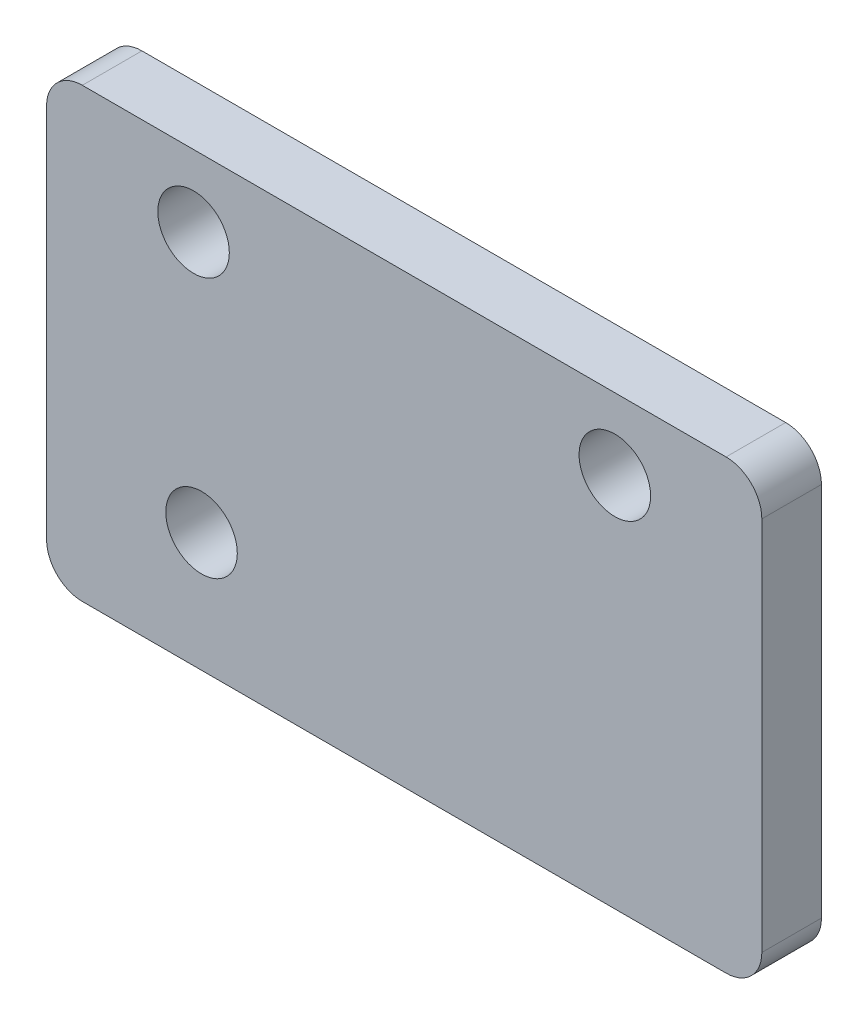
ISO-10303-21;
HEADER;
FILE_DESCRIPTION(('STEP AP214'),'2;1');
FILE_NAME('part.step','',(''),(''),'','','');
FILE_SCHEMA(('AUTOMOTIVE_DESIGN { 1 0 10303 214 1 1 1 1 }'));
ENDSEC;
DATA;
#1=APPLICATION_CONTEXT('core data for automotive mechanical design processes');
#2=APPLICATION_PROTOCOL_DEFINITION('international standard','automotive_design',2000,#1);
#3=PRODUCT_CONTEXT('',#1,'mechanical');
#4=PRODUCT('Part','Part','',(#3));
#5=PRODUCT_RELATED_PRODUCT_CATEGORY('part','',(#4));
#6=PRODUCT_DEFINITION_FORMATION('','',#4);
#7=PRODUCT_DEFINITION_CONTEXT('part definition',#1,'design');
#8=PRODUCT_DEFINITION('design','',#6,#7);
#9=PRODUCT_DEFINITION_SHAPE('','',#8);
#10=(LENGTH_UNIT() NAMED_UNIT(*) SI_UNIT(.MILLI.,.METRE.));
#11=(NAMED_UNIT(*) PLANE_ANGLE_UNIT() SI_UNIT($,.RADIAN.));
#12=(NAMED_UNIT(*) SI_UNIT($,.STERADIAN.) SOLID_ANGLE_UNIT());
#13=UNCERTAINTY_MEASURE_WITH_UNIT(LENGTH_MEASURE(1.E-05),#10,'distance_accuracy_value','');
#14=(GEOMETRIC_REPRESENTATION_CONTEXT(3) GLOBAL_UNCERTAINTY_ASSIGNED_CONTEXT((#13)) GLOBAL_UNIT_ASSIGNED_CONTEXT((#10,
#11,#12)) REPRESENTATION_CONTEXT('',''));
#15=CARTESIAN_POINT('',(0.,0.,0.));
#16=DIRECTION('',(0.,0.,1.));
#17=DIRECTION('',(1.,0.,0.));
#18=AXIS2_PLACEMENT_3D('',#15,#16,#17);
#19=CARTESIAN_POINT('',(38.5,-6.99999999999999,5.));
#20=DIRECTION('',(0.,0.,-1.));
#21=DIRECTION('',(-1.,0.,0.));
#22=AXIS2_PLACEMENT_3D('',#19,#20,#21);
#23=CYLINDRICAL_SURFACE('',#22,3.);
#24=CARTESIAN_POINT('',(38.5,-6.99999999999999,0.));
#25=DIRECTION('',(0.,0.,1.));
#26=DIRECTION('',(1.,0.,0.));
#27=AXIS2_PLACEMENT_3D('',#24,#25,#26);
#28=CIRCLE('',#27,3.);
#29=CARTESIAN_POINT('',(38.5,-9.99999999999999,0.));
#30=VERTEX_POINT('',#29);
#31=CARTESIAN_POINT('',(41.5,-6.99999999999997,0.));
#32=VERTEX_POINT('',#31);
#33=EDGE_CURVE('E137',#30,#32,#28,.T.);
#34=ORIENTED_EDGE('',*,*,#33,.T.);
#35=DIRECTION('',(0.,0.,-1.));
#36=VECTOR('',#35,1.);
#37=CARTESIAN_POINT('',(41.5,-6.99999999999997,5.));
#38=LINE('',#37,#36);
#39=CARTESIAN_POINT('',(41.5,-6.99999999999997,5.));
#40=VERTEX_POINT('',#39);
#41=EDGE_CURVE('E49',#40,#32,#38,.T.);
#42=ORIENTED_EDGE('',*,*,#41,.F.);
#43=CARTESIAN_POINT('',(38.5,-6.99999999999999,5.));
#44=DIRECTION('',(0.,0.,1.));
#45=DIRECTION('',(1.,0.,0.));
#46=AXIS2_PLACEMENT_3D('',#43,#44,#45);
#47=CIRCLE('',#46,3.);
#48=CARTESIAN_POINT('',(38.5,-9.99999999999999,5.));
#49=VERTEX_POINT('',#48);
#50=EDGE_CURVE('E212',#49,#40,#47,.T.);
#51=ORIENTED_EDGE('',*,*,#50,.F.);
#52=DIRECTION('',(0.,0.,-1.));
#53=VECTOR('',#52,1.);
#54=CARTESIAN_POINT('',(38.5,-9.99999999999999,5.));
#55=LINE('',#54,#53);
#56=EDGE_CURVE('E11',#49,#30,#55,.T.);
#57=ORIENTED_EDGE('',*,*,#56,.T.);
#58=EDGE_LOOP('',(#34,#42,#51,#57));
#59=FACE_BOUND('',#58,.T.);
#60=ADVANCED_FACE('F41',(#59),#23,.T.);
#61=CARTESIAN_POINT('',(41.5,24.5,5.));
#62=DIRECTION('',(-1.,0.,0.));
#63=DIRECTION('',(0.,-1.,0.));
#64=AXIS2_PLACEMENT_3D('',#61,#62,#63);
#65=PLANE('',#64);
#66=DIRECTION('',(0.,1.,0.));
#67=VECTOR('',#66,1.);
#68=CARTESIAN_POINT('',(41.5,24.5,0.));
#69=LINE('',#68,#67);
#70=CARTESIAN_POINT('',(41.5,24.5,0.));
#71=VERTEX_POINT('',#70);
#72=EDGE_CURVE('E145',#32,#71,#69,.T.);
#73=ORIENTED_EDGE('',*,*,#72,.T.);
#74=DIRECTION('',(0.,0.,-1.));
#75=VECTOR('',#74,1.);
#76=CARTESIAN_POINT('',(41.5,24.5,5.));
#77=LINE('',#76,#75);
#78=CARTESIAN_POINT('',(41.5,24.5,5.));
#79=VERTEX_POINT('',#78);
#80=EDGE_CURVE('E157',#79,#71,#77,.T.);
#81=ORIENTED_EDGE('',*,*,#80,.F.);
#82=DIRECTION('',(0.,1.,0.));
#83=VECTOR('',#82,1.);
#84=CARTESIAN_POINT('',(41.5,24.5,5.));
#85=LINE('',#84,#83);
#86=EDGE_CURVE('E201',#40,#79,#85,.T.);
#87=ORIENTED_EDGE('',*,*,#86,.F.);
#88=ORIENTED_EDGE('',*,*,#41,.T.);
#89=EDGE_LOOP('',(#73,#81,#87,#88));
#90=FACE_BOUND('',#89,.T.);
#91=ADVANCED_FACE('F194',(#90),#65,.F.);
#92=CARTESIAN_POINT('',(38.5,24.5,5.));
#93=DIRECTION('',(0.,0.,-1.));
#94=DIRECTION('',(-1.,0.,0.));
#95=AXIS2_PLACEMENT_3D('',#92,#93,#94);
#96=CYLINDRICAL_SURFACE('',#95,3.);
#97=CARTESIAN_POINT('',(38.5,24.5,0.));
#98=DIRECTION('',(0.,0.,1.));
#99=DIRECTION('',(-1.,0.,0.));
#100=AXIS2_PLACEMENT_3D('',#97,#98,#99);
#101=CIRCLE('',#100,3.);
#102=CARTESIAN_POINT('',(38.5,27.5,0.));
#103=VERTEX_POINT('',#102);
#104=EDGE_CURVE('E143',#71,#103,#101,.T.);
#105=ORIENTED_EDGE('',*,*,#104,.T.);
#106=DIRECTION('',(0.,0.,-1.));
#107=VECTOR('',#106,1.);
#108=CARTESIAN_POINT('',(38.5,27.5,5.));
#109=LINE('',#108,#107);
#110=CARTESIAN_POINT('',(38.5,27.5,5.));
#111=VERTEX_POINT('',#110);
#112=EDGE_CURVE('E160',#111,#103,#109,.T.);
#113=ORIENTED_EDGE('',*,*,#112,.F.);
#114=CARTESIAN_POINT('',(38.5,24.5,5.));
#115=DIRECTION('',(0.,0.,1.));
#116=DIRECTION('',(-1.,0.,0.));
#117=AXIS2_PLACEMENT_3D('',#114,#115,#116);
#118=CIRCLE('',#117,3.);
#119=EDGE_CURVE('E214',#79,#111,#118,.T.);
#120=ORIENTED_EDGE('',*,*,#119,.F.);
#121=ORIENTED_EDGE('',*,*,#80,.T.);
#122=EDGE_LOOP('',(#105,#113,#120,#121));
#123=FACE_BOUND('',#122,.T.);
#124=ADVANCED_FACE('F198',(#123),#96,.T.);
#125=CARTESIAN_POINT('',(-15.5,27.5,5.));
#126=DIRECTION('',(0.,-1.,0.));
#127=DIRECTION('',(1.,0.,0.));
#128=AXIS2_PLACEMENT_3D('',#125,#126,#127);
#129=PLANE('',#128);
#130=DIRECTION('',(-1.,0.,0.));
#131=VECTOR('',#130,1.);
#132=CARTESIAN_POINT('',(-15.5,27.5,0.));
#133=LINE('',#132,#131);
#134=CARTESIAN_POINT('',(-15.5,27.5,0.));
#135=VERTEX_POINT('',#134);
#136=EDGE_CURVE('E146',#103,#135,#133,.T.);
#137=ORIENTED_EDGE('',*,*,#136,.T.);
#138=DIRECTION('',(0.,0.,-1.));
#139=VECTOR('',#138,1.);
#140=CARTESIAN_POINT('',(-15.5,27.5,5.));
#141=LINE('',#140,#139);
#142=CARTESIAN_POINT('',(-15.5,27.5,5.));
#143=VERTEX_POINT('',#142);
#144=EDGE_CURVE('E128',#143,#135,#141,.T.);
#145=ORIENTED_EDGE('',*,*,#144,.F.);
#146=DIRECTION('',(-1.,0.,0.));
#147=VECTOR('',#146,1.);
#148=CARTESIAN_POINT('',(-15.5,27.5,5.));
#149=LINE('',#148,#147);
#150=EDGE_CURVE('E119',#111,#143,#149,.T.);
#151=ORIENTED_EDGE('',*,*,#150,.F.);
#152=ORIENTED_EDGE('',*,*,#112,.T.);
#153=EDGE_LOOP('',(#137,#145,#151,#152));
#154=FACE_BOUND('',#153,.T.);
#155=ADVANCED_FACE('F208',(#154),#129,.F.);
#156=CARTESIAN_POINT('',(-15.5,24.5,5.));
#157=DIRECTION('',(0.,0.,-1.));
#158=DIRECTION('',(-1.,0.,0.));
#159=AXIS2_PLACEMENT_3D('',#156,#157,#158);
#160=CYLINDRICAL_SURFACE('',#159,3.);
#161=CARTESIAN_POINT('',(-15.5,24.5,0.));
#162=DIRECTION('',(0.,0.,1.));
#163=DIRECTION('',(1.,0.,0.));
#164=AXIS2_PLACEMENT_3D('',#161,#162,#163);
#165=CIRCLE('',#164,3.);
#166=CARTESIAN_POINT('',(-18.5,24.5,0.));
#167=VERTEX_POINT('',#166);
#168=EDGE_CURVE('E130',#135,#167,#165,.T.);
#169=ORIENTED_EDGE('',*,*,#168,.T.);
#170=DIRECTION('',(0.,0.,-1.));
#171=VECTOR('',#170,1.);
#172=CARTESIAN_POINT('',(-18.5,24.5,5.));
#173=LINE('',#172,#171);
#174=CARTESIAN_POINT('',(-18.5,24.5,5.));
#175=VERTEX_POINT('',#174);
#176=EDGE_CURVE('E123',#175,#167,#173,.T.);
#177=ORIENTED_EDGE('',*,*,#176,.F.);
#178=CARTESIAN_POINT('',(-15.5,24.5,5.));
#179=DIRECTION('',(0.,0.,1.));
#180=DIRECTION('',(1.,0.,0.));
#181=AXIS2_PLACEMENT_3D('',#178,#179,#180);
#182=CIRCLE('',#181,3.);
#183=EDGE_CURVE('E112',#143,#175,#182,.T.);
#184=ORIENTED_EDGE('',*,*,#183,.F.);
#185=ORIENTED_EDGE('',*,*,#144,.T.);
#186=EDGE_LOOP('',(#169,#177,#184,#185));
#187=FACE_BOUND('',#186,.T.);
#188=ADVANCED_FACE('F129',(#187),#160,.T.);
#189=CARTESIAN_POINT('',(-18.5,24.5,5.));
#190=DIRECTION('',(1.,0.,0.));
#191=DIRECTION('',(0.,1.,0.));
#192=AXIS2_PLACEMENT_3D('',#189,#190,#191);
#193=PLANE('',#192);
#194=DIRECTION('',(0.,-1.,0.));
#195=VECTOR('',#194,1.);
#196=CARTESIAN_POINT('',(-18.5,24.5,0.));
#197=LINE('',#196,#195);
#198=CARTESIAN_POINT('',(-18.5,-6.99999999999998,0.));
#199=VERTEX_POINT('',#198);
#200=EDGE_CURVE('E87',#167,#199,#197,.T.);
#201=ORIENTED_EDGE('',*,*,#200,.T.);
#202=DIRECTION('',(0.,0.,-1.));
#203=VECTOR('',#202,1.);
#204=CARTESIAN_POINT('',(-18.5,-6.99999999999998,5.));
#205=LINE('',#204,#203);
#206=CARTESIAN_POINT('',(-18.5,-6.99999999999998,5.));
#207=VERTEX_POINT('',#206);
#208=EDGE_CURVE('E127',#207,#199,#205,.T.);
#209=ORIENTED_EDGE('',*,*,#208,.F.);
#210=DIRECTION('',(0.,-1.,0.));
#211=VECTOR('',#210,1.);
#212=CARTESIAN_POINT('',(-18.5,24.5,5.));
#213=LINE('',#212,#211);
#214=EDGE_CURVE('E117',#175,#207,#213,.T.);
#215=ORIENTED_EDGE('',*,*,#214,.F.);
#216=ORIENTED_EDGE('',*,*,#176,.T.);
#217=EDGE_LOOP('',(#201,#209,#215,#216));
#218=FACE_BOUND('',#217,.T.);
#219=ADVANCED_FACE('F135',(#218),#193,.F.);
#220=CARTESIAN_POINT('',(-15.5,-7.,5.));
#221=DIRECTION('',(0.,0.,-1.));
#222=DIRECTION('',(-1.,0.,0.));
#223=AXIS2_PLACEMENT_3D('',#220,#221,#222);
#224=CYLINDRICAL_SURFACE('',#223,3.);
#225=CARTESIAN_POINT('',(-15.5,-7.,0.));
#226=DIRECTION('',(0.,0.,1.));
#227=DIRECTION('',(1.,0.,0.));
#228=AXIS2_PLACEMENT_3D('',#225,#226,#227);
#229=CIRCLE('',#228,3.);
#230=CARTESIAN_POINT('',(-15.5,-10.,0.));
#231=VERTEX_POINT('',#230);
#232=EDGE_CURVE('E153',#199,#231,#229,.T.);
#233=ORIENTED_EDGE('',*,*,#232,.T.);
#234=DIRECTION('',(0.,0.,-1.));
#235=VECTOR('',#234,1.);
#236=CARTESIAN_POINT('',(-15.5,-10.,5.));
#237=LINE('',#236,#235);
#238=CARTESIAN_POINT('',(-15.5,-10.,5.));
#239=VERTEX_POINT('',#238);
#240=EDGE_CURVE('E138',#239,#231,#237,.T.);
#241=ORIENTED_EDGE('',*,*,#240,.F.);
#242=CARTESIAN_POINT('',(-15.5,-7.,5.));
#243=DIRECTION('',(0.,0.,1.));
#244=DIRECTION('',(1.,0.,0.));
#245=AXIS2_PLACEMENT_3D('',#242,#243,#244);
#246=CIRCLE('',#245,3.);
#247=EDGE_CURVE('E132',#207,#239,#246,.T.);
#248=ORIENTED_EDGE('',*,*,#247,.F.);
#249=ORIENTED_EDGE('',*,*,#208,.T.);
#250=EDGE_LOOP('',(#233,#241,#248,#249));
#251=FACE_BOUND('',#250,.T.);
#252=ADVANCED_FACE('F237',(#251),#224,.T.);
#253=CARTESIAN_POINT('',(31.175,-9.99999999999999,5.));
#254=DIRECTION('',(0.,1.,0.));
#255=DIRECTION('',(-1.,0.,0.));
#256=AXIS2_PLACEMENT_3D('',#253,#254,#255);
#257=PLANE('',#256);
#258=DIRECTION('',(1.,0.,0.));
#259=VECTOR('',#258,1.);
#260=CARTESIAN_POINT('',(31.175,-9.99999999999999,0.));
#261=LINE('',#260,#259);
#262=EDGE_CURVE('E98',#231,#30,#261,.T.);
#263=ORIENTED_EDGE('',*,*,#262,.T.);
#264=ORIENTED_EDGE('',*,*,#56,.F.);
#265=DIRECTION('',(1.,0.,0.));
#266=VECTOR('',#265,1.);
#267=CARTESIAN_POINT('',(33.3,-9.99999999999999,5.));
#268=LINE('',#267,#266);
#269=EDGE_CURVE('E56',#239,#49,#268,.T.);
#270=ORIENTED_EDGE('',*,*,#269,.F.);
#271=ORIENTED_EDGE('',*,*,#240,.T.);
#272=EDGE_LOOP('',(#263,#264,#270,#271));
#273=FACE_BOUND('',#272,.T.);
#274=ADVANCED_FACE('F231',(#273),#257,.F.);
#275=CARTESIAN_POINT('',(-15.5,-7.,5.));
#276=DIRECTION('',(0.,0.,1.));
#277=DIRECTION('',(1.,0.,0.));
#278=AXIS2_PLACEMENT_3D('',#275,#276,#277);
#279=PLANE('',#278);
#280=CARTESIAN_POINT('',(-5.5,0.,5.));
#281=DIRECTION('',(0.,0.,1.));
#282=DIRECTION('',(1.,0.,0.));
#283=AXIS2_PLACEMENT_3D('',#280,#281,#282);
#284=CIRCLE('',#283,3.);
#285=CARTESIAN_POINT('',(-2.5,0.,5.));
#286=VERTEX_POINT('',#285);
#287=EDGE_CURVE('E225',#286,#286,#284,.T.);
#288=ORIENTED_EDGE('',*,*,#287,.F.);
#289=EDGE_LOOP('',(#288));
#290=FACE_BOUND('',#289,.T.);
#291=CARTESIAN_POINT('',(-6.17,21.5,5.));
#292=DIRECTION('',(0.,0.,1.));
#293=DIRECTION('',(1.,0.,0.));
#294=AXIS2_PLACEMENT_3D('',#291,#292,#293);
#295=CIRCLE('',#294,3.);
#296=CARTESIAN_POINT('',(-3.17,21.5,5.));
#297=VERTEX_POINT('',#296);
#298=EDGE_CURVE('E170',#297,#297,#295,.T.);
#299=ORIENTED_EDGE('',*,*,#298,.F.);
#300=EDGE_LOOP('',(#299));
#301=FACE_BOUND('',#300,.T.);
#302=CARTESIAN_POINT('',(29.17,21.5,5.));
#303=DIRECTION('',(0.,0.,1.));
#304=DIRECTION('',(1.,0.,0.));
#305=AXIS2_PLACEMENT_3D('',#302,#303,#304);
#306=CIRCLE('',#305,3.);
#307=CARTESIAN_POINT('',(32.17,21.5,5.));
#308=VERTEX_POINT('',#307);
#309=EDGE_CURVE('E216',#308,#308,#306,.T.);
#310=ORIENTED_EDGE('',*,*,#309,.F.);
#311=EDGE_LOOP('',(#310));
#312=FACE_BOUND('',#311,.T.);
#313=ORIENTED_EDGE('',*,*,#269,.T.);
#314=ORIENTED_EDGE('',*,*,#50,.T.);
#315=ORIENTED_EDGE('',*,*,#86,.T.);
#316=ORIENTED_EDGE('',*,*,#119,.T.);
#317=ORIENTED_EDGE('',*,*,#150,.T.);
#318=ORIENTED_EDGE('',*,*,#183,.T.);
#319=ORIENTED_EDGE('',*,*,#214,.T.);
#320=ORIENTED_EDGE('',*,*,#247,.T.);
#321=EDGE_LOOP('',(#313,#314,#315,#316,#317,#318,#319,#320));
#322=FACE_BOUND('',#321,.T.);
#323=ADVANCED_FACE('F116',(#290,#301,#312,#322),#279,.T.);
#324=CARTESIAN_POINT('',(-15.5,-7.,0.));
#325=DIRECTION('',(0.,0.,1.));
#326=DIRECTION('',(1.,0.,0.));
#327=AXIS2_PLACEMENT_3D('',#324,#325,#326);
#328=PLANE('',#327);
#329=CARTESIAN_POINT('',(-5.5,0.,0.));
#330=DIRECTION('',(0.,0.,1.));
#331=DIRECTION('',(1.,0.,0.));
#332=AXIS2_PLACEMENT_3D('',#329,#330,#331);
#333=CIRCLE('',#332,3.);
#334=CARTESIAN_POINT('',(-2.5,0.,0.));
#335=VERTEX_POINT('',#334);
#336=EDGE_CURVE('E42',#335,#335,#333,.T.);
#337=ORIENTED_EDGE('',*,*,#336,.T.);
#338=EDGE_LOOP('',(#337));
#339=FACE_BOUND('',#338,.T.);
#340=CARTESIAN_POINT('',(-6.17,21.5,0.));
#341=DIRECTION('',(0.,0.,1.));
#342=DIRECTION('',(1.,0.,0.));
#343=AXIS2_PLACEMENT_3D('',#340,#341,#342);
#344=CIRCLE('',#343,3.);
#345=CARTESIAN_POINT('',(-3.17,21.5,0.));
#346=VERTEX_POINT('',#345);
#347=EDGE_CURVE('E141',#346,#346,#344,.T.);
#348=ORIENTED_EDGE('',*,*,#347,.T.);
#349=EDGE_LOOP('',(#348));
#350=FACE_BOUND('',#349,.T.);
#351=CARTESIAN_POINT('',(29.17,21.5,0.));
#352=DIRECTION('',(0.,0.,1.));
#353=DIRECTION('',(1.,0.,0.));
#354=AXIS2_PLACEMENT_3D('',#351,#352,#353);
#355=CIRCLE('',#354,3.);
#356=CARTESIAN_POINT('',(32.17,21.5,0.));
#357=VERTEX_POINT('',#356);
#358=EDGE_CURVE('E164',#357,#357,#355,.T.);
#359=ORIENTED_EDGE('',*,*,#358,.T.);
#360=EDGE_LOOP('',(#359));
#361=FACE_BOUND('',#360,.T.);
#362=ORIENTED_EDGE('',*,*,#33,.F.);
#363=ORIENTED_EDGE('',*,*,#262,.F.);
#364=ORIENTED_EDGE('',*,*,#232,.F.);
#365=ORIENTED_EDGE('',*,*,#200,.F.);
#366=ORIENTED_EDGE('',*,*,#168,.F.);
#367=ORIENTED_EDGE('',*,*,#136,.F.);
#368=ORIENTED_EDGE('',*,*,#104,.F.);
#369=ORIENTED_EDGE('',*,*,#72,.F.);
#370=EDGE_LOOP('',(#362,#363,#364,#365,#366,#367,#368,#369));
#371=FACE_BOUND('',#370,.T.);
#372=ADVANCED_FACE('F171',(#339,#350,#361,#371),#328,.F.);
#373=CARTESIAN_POINT('',(29.17,21.5,-5.));
#374=DIRECTION('',(0.,0.,1.));
#375=DIRECTION('',(1.,0.,0.));
#376=AXIS2_PLACEMENT_3D('',#373,#374,#375);
#377=CYLINDRICAL_SURFACE('',#376,3.);
#378=ORIENTED_EDGE('',*,*,#309,.T.);
#379=EDGE_LOOP('',(#378));
#380=FACE_BOUND('',#379,.T.);
#381=ORIENTED_EDGE('',*,*,#358,.F.);
#382=EDGE_LOOP('',(#381));
#383=FACE_BOUND('',#382,.T.);
#384=ADVANCED_FACE('F180',(#380,#383),#377,.F.);
#385=CARTESIAN_POINT('',(-6.17,21.5,-5.));
#386=DIRECTION('',(0.,0.,1.));
#387=DIRECTION('',(1.,0.,0.));
#388=AXIS2_PLACEMENT_3D('',#385,#386,#387);
#389=CYLINDRICAL_SURFACE('',#388,3.);
#390=ORIENTED_EDGE('',*,*,#298,.T.);
#391=EDGE_LOOP('',(#390));
#392=FACE_BOUND('',#391,.T.);
#393=ORIENTED_EDGE('',*,*,#347,.F.);
#394=EDGE_LOOP('',(#393));
#395=FACE_BOUND('',#394,.T.);
#396=ADVANCED_FACE('F172',(#392,#395),#389,.F.);
#397=CARTESIAN_POINT('',(-5.5,0.,-5.));
#398=DIRECTION('',(0.,0.,1.));
#399=DIRECTION('',(1.,0.,0.));
#400=AXIS2_PLACEMENT_3D('',#397,#398,#399);
#401=CYLINDRICAL_SURFACE('',#400,3.);
#402=ORIENTED_EDGE('',*,*,#287,.T.);
#403=EDGE_LOOP('',(#402));
#404=FACE_BOUND('',#403,.T.);
#405=ORIENTED_EDGE('',*,*,#336,.F.);
#406=EDGE_LOOP('',(#405));
#407=FACE_BOUND('',#406,.T.);
#408=ADVANCED_FACE('F176',(#404,#407),#401,.F.);
#409=CLOSED_SHELL('',(#60,#91,#124,#155,#188,#219,#252,#274,#323,#372,#384,#396,#408));
#410=MANIFOLD_SOLID_BREP('B2',#409);
#411=ADVANCED_BREP_SHAPE_REPRESENTATION('',(#18,#410),#14);
#412=SHAPE_DEFINITION_REPRESENTATION(#9,#411);
ENDSEC;
END-ISO-10303-21;
